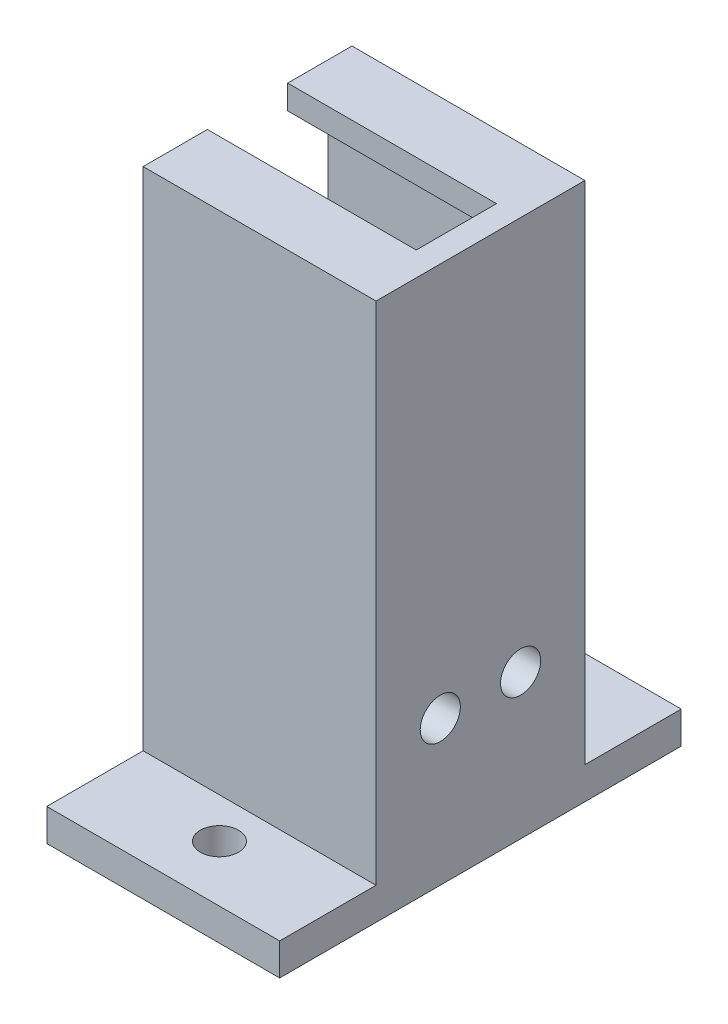
ISO-10303-21;
HEADER;
FILE_DESCRIPTION(('STEP AP214'),'2;1');
FILE_NAME('part.step','',(''),(''),'','','');
FILE_SCHEMA(('AUTOMOTIVE_DESIGN { 1 0 10303 214 1 1 1 1 }'));
ENDSEC;
DATA;
#1=APPLICATION_CONTEXT('core data for automotive mechanical design processes');
#2=APPLICATION_PROTOCOL_DEFINITION('international standard','automotive_design',2000,#1);
#3=PRODUCT_CONTEXT('',#1,'mechanical');
#4=PRODUCT('Part','Part','',(#3));
#5=PRODUCT_RELATED_PRODUCT_CATEGORY('part','',(#4));
#6=PRODUCT_DEFINITION_FORMATION('','',#4);
#7=PRODUCT_DEFINITION_CONTEXT('part definition',#1,'design');
#8=PRODUCT_DEFINITION('design','',#6,#7);
#9=PRODUCT_DEFINITION_SHAPE('','',#8);
#10=(LENGTH_UNIT() NAMED_UNIT(*) SI_UNIT(.MILLI.,.METRE.));
#11=(NAMED_UNIT(*) PLANE_ANGLE_UNIT() SI_UNIT($,.RADIAN.));
#12=(NAMED_UNIT(*) SI_UNIT($,.STERADIAN.) SOLID_ANGLE_UNIT());
#13=UNCERTAINTY_MEASURE_WITH_UNIT(LENGTH_MEASURE(1.E-05),#10,'distance_accuracy_value','');
#14=(GEOMETRIC_REPRESENTATION_CONTEXT(3) GLOBAL_UNCERTAINTY_ASSIGNED_CONTEXT((#13)) GLOBAL_UNIT_ASSIGNED_CONTEXT((#10,
#11,#12)) REPRESENTATION_CONTEXT('',''));
#15=CARTESIAN_POINT('',(0.,0.,0.));
#16=DIRECTION('',(0.,0.,1.));
#17=DIRECTION('',(1.,0.,0.));
#18=AXIS2_PLACEMENT_3D('',#15,#16,#17);
#19=CARTESIAN_POINT('',(0.,44.,26.));
#20=DIRECTION('',(0.,-1.,0.));
#21=DIRECTION('',(0.,0.,-1.));
#22=AXIS2_PLACEMENT_3D('',#19,#20,#21);
#23=PLANE('',#22);
#24=DIRECTION('',(-1.,0.,0.));
#25=VECTOR('',#24,1.);
#26=CARTESIAN_POINT('',(0.,44.,18.));
#27=LINE('',#26,#25);
#28=CARTESIAN_POINT('',(26.,44.,18.));
#29=VERTEX_POINT('',#28);
#30=CARTESIAN_POINT('',(0.,44.,18.));
#31=VERTEX_POINT('',#30);
#32=EDGE_CURVE('E11',#29,#31,#27,.T.);
#33=ORIENTED_EDGE('',*,*,#32,.F.);
#34=DIRECTION('',(0.,0.,-1.));
#35=VECTOR('',#34,1.);
#36=CARTESIAN_POINT('',(26.,44.,26.));
#37=LINE('',#36,#35);
#38=CARTESIAN_POINT('',(26.,44.,23.));
#39=VERTEX_POINT('',#38);
#40=EDGE_CURVE('E246',#39,#29,#37,.T.);
#41=ORIENTED_EDGE('',*,*,#40,.F.);
#42=DIRECTION('',(-1.,0.,0.));
#43=VECTOR('',#42,1.);
#44=CARTESIAN_POINT('',(0.,44.,23.));
#45=LINE('',#44,#43);
#46=CARTESIAN_POINT('',(0.,44.,23.));
#47=VERTEX_POINT('',#46);
#48=EDGE_CURVE('E261',#39,#47,#45,.T.);
#49=ORIENTED_EDGE('',*,*,#48,.T.);
#50=DIRECTION('',(0.,0.,-1.));
#51=VECTOR('',#50,1.);
#52=CARTESIAN_POINT('',(0.,44.,26.));
#53=LINE('',#52,#51);
#54=EDGE_CURVE('E274',#47,#31,#53,.T.);
#55=ORIENTED_EDGE('',*,*,#54,.T.);
#56=EDGE_LOOP('',(#33,#41,#49,#55));
#57=FACE_BOUND('',#56,.T.);
#58=ADVANCED_FACE('F39',(#57),#23,.T.);
#59=CARTESIAN_POINT('',(0.,0.,26.));
#60=DIRECTION('',(1.,0.,0.));
#61=DIRECTION('',(0.,1.,0.));
#62=AXIS2_PLACEMENT_3D('',#59,#60,#61);
#63=PLANE('',#62);
#64=CARTESIAN_POINT('',(0.,-2.,8.));
#65=DIRECTION('',(-1.,0.,0.));
#66=DIRECTION('',(0.,-1.,0.));
#67=AXIS2_PLACEMENT_3D('',#64,#65,#66);
#68=CIRCLE('',#67,2.5);
#69=CARTESIAN_POINT('',(0.,-4.5,8.));
#70=VERTEX_POINT('',#69);
#71=EDGE_CURVE('E198',#70,#70,#68,.T.);
#72=ORIENTED_EDGE('',*,*,#71,.F.);
#73=EDGE_LOOP('',(#72));
#74=FACE_BOUND('',#73,.T.);
#75=CARTESIAN_POINT('',(0.,-2.,18.));
#76=DIRECTION('',(-1.,0.,0.));
#77=DIRECTION('',(0.,-1.,0.));
#78=AXIS2_PLACEMENT_3D('',#75,#76,#77);
#79=CIRCLE('',#78,2.49999999999999);
#80=CARTESIAN_POINT('',(0.,-4.5,18.));
#81=VERTEX_POINT('',#80);
#82=EDGE_CURVE('E182',#81,#81,#79,.T.);
#83=ORIENTED_EDGE('',*,*,#82,.F.);
#84=EDGE_LOOP('',(#83));
#85=FACE_BOUND('',#84,.T.);
#86=DIRECTION('',(0.,0.,-1.));
#87=VECTOR('',#86,1.);
#88=CARTESIAN_POINT('',(0.,47.,26.));
#89=LINE('',#88,#87);
#90=CARTESIAN_POINT('',(0.,47.,26.));
#91=VERTEX_POINT('',#90);
#92=CARTESIAN_POINT('',(0.,47.,18.));
#93=VERTEX_POINT('',#92);
#94=EDGE_CURVE('E300',#91,#93,#89,.T.);
#95=ORIENTED_EDGE('',*,*,#94,.T.);
#96=DIRECTION('',(0.,1.,0.));
#97=VECTOR('',#96,1.);
#98=CARTESIAN_POINT('',(0.,39.8846153846153,18.));
#99=LINE('',#98,#97);
#100=EDGE_CURVE('E212',#31,#93,#99,.T.);
#101=ORIENTED_EDGE('',*,*,#100,.F.);
#102=ORIENTED_EDGE('',*,*,#54,.F.);
#103=DIRECTION('',(0.,-1.,0.));
#104=VECTOR('',#103,1.);
#105=CARTESIAN_POINT('',(0.,0.,23.));
#106=LINE('',#105,#104);
#107=CARTESIAN_POINT('',(0.,3.,23.));
#108=VERTEX_POINT('',#107);
#109=EDGE_CURVE('E63',#47,#108,#106,.T.);
#110=ORIENTED_EDGE('',*,*,#109,.T.);
#111=DIRECTION('',(0.,0.,-1.));
#112=VECTOR('',#111,1.);
#113=CARTESIAN_POINT('',(0.,3.,26.));
#114=LINE('',#113,#112);
#115=CARTESIAN_POINT('',(0.,3.,3.));
#116=VERTEX_POINT('',#115);
#117=EDGE_CURVE('E245',#108,#116,#114,.T.);
#118=ORIENTED_EDGE('',*,*,#117,.T.);
#119=DIRECTION('',(0.,-1.,0.));
#120=VECTOR('',#119,1.);
#121=CARTESIAN_POINT('',(0.,0.,3.));
#122=LINE('',#121,#120);
#123=CARTESIAN_POINT('',(0.,44.,3.));
#124=VERTEX_POINT('',#123);
#125=EDGE_CURVE('E236',#124,#116,#122,.T.);
#126=ORIENTED_EDGE('',*,*,#125,.F.);
#127=CARTESIAN_POINT('',(0.,44.,8.));
#128=VERTEX_POINT('',#127);
#129=EDGE_CURVE('E267',#128,#124,#53,.T.);
#130=ORIENTED_EDGE('',*,*,#129,.F.);
#131=DIRECTION('',(0.,-1.,0.));
#132=VECTOR('',#131,1.);
#133=CARTESIAN_POINT('',(0.,39.8846153846153,8.));
#134=LINE('',#133,#132);
#135=CARTESIAN_POINT('',(0.,47.,8.));
#136=VERTEX_POINT('',#135);
#137=EDGE_CURVE('E217',#136,#128,#134,.T.);
#138=ORIENTED_EDGE('',*,*,#137,.F.);
#139=CARTESIAN_POINT('',(0.,47.,0.));
#140=VERTEX_POINT('',#139);
#141=EDGE_CURVE('E291',#136,#140,#89,.T.);
#142=ORIENTED_EDGE('',*,*,#141,.T.);
#143=DIRECTION('',(0.,-1.,0.));
#144=VECTOR('',#143,1.);
#145=CARTESIAN_POINT('',(0.,0.,0.));
#146=LINE('',#145,#144);
#147=CARTESIAN_POINT('',(0.,-16.,0.));
#148=VERTEX_POINT('',#147);
#149=EDGE_CURVE('E271',#140,#148,#146,.T.);
#150=ORIENTED_EDGE('',*,*,#149,.T.);
#151=DIRECTION('',(0.,0.,-1.));
#152=VECTOR('',#151,1.);
#153=CARTESIAN_POINT('',(0.,-16.,-12.));
#154=LINE('',#153,#152);
#155=CARTESIAN_POINT('',(0.,-16.,-12.));
#156=VERTEX_POINT('',#155);
#157=EDGE_CURVE('E409',#148,#156,#154,.T.);
#158=ORIENTED_EDGE('',*,*,#157,.T.);
#159=DIRECTION('',(0.,1.,0.));
#160=VECTOR('',#159,1.);
#161=CARTESIAN_POINT('',(0.,-20.,-12.));
#162=LINE('',#161,#160);
#163=CARTESIAN_POINT('',(0.,-20.,-12.));
#164=VERTEX_POINT('',#163);
#165=EDGE_CURVE('E189',#164,#156,#162,.T.);
#166=ORIENTED_EDGE('',*,*,#165,.F.);
#167=DIRECTION('',(0.,0.,-1.));
#168=VECTOR('',#167,1.);
#169=CARTESIAN_POINT('',(0.,-20.,-12.));
#170=LINE('',#169,#168);
#171=CARTESIAN_POINT('',(0.,-20.,38.));
#172=VERTEX_POINT('',#171);
#173=EDGE_CURVE('E163',#172,#164,#170,.T.);
#174=ORIENTED_EDGE('',*,*,#173,.F.);
#175=DIRECTION('',(0.,1.,0.));
#176=VECTOR('',#175,1.);
#177=CARTESIAN_POINT('',(0.,-20.,38.));
#178=LINE('',#177,#176);
#179=CARTESIAN_POINT('',(0.,-16.,38.));
#180=VERTEX_POINT('',#179);
#181=EDGE_CURVE('E159',#172,#180,#178,.T.);
#182=ORIENTED_EDGE('',*,*,#181,.T.);
#183=CARTESIAN_POINT('',(0.,-16.,26.));
#184=VERTEX_POINT('',#183);
#185=EDGE_CURVE('E413',#180,#184,#154,.T.);
#186=ORIENTED_EDGE('',*,*,#185,.T.);
#187=DIRECTION('',(0.,-1.,0.));
#188=VECTOR('',#187,1.);
#189=CARTESIAN_POINT('',(0.,0.,26.));
#190=LINE('',#189,#188);
#191=EDGE_CURVE('E281',#91,#184,#190,.T.);
#192=ORIENTED_EDGE('',*,*,#191,.F.);
#193=EDGE_LOOP('',(#95,#101,#102,#110,#118,#126,#130,#138,#142,#150,#158,#166,#174,#182,#186,#192));
#194=FACE_BOUND('',#193,.T.);
#195=ADVANCED_FACE('F41',(#74,#85,#194),#63,.F.);
#196=CARTESIAN_POINT('',(29.,0.,26.));
#197=DIRECTION('',(-1.,0.,0.));
#198=DIRECTION('',(0.,-1.,0.));
#199=AXIS2_PLACEMENT_3D('',#196,#197,#198);
#200=PLANE('',#199);
#201=CARTESIAN_POINT('',(29.,-2.00000000000001,8.));
#202=DIRECTION('',(-1.,0.,0.));
#203=DIRECTION('',(0.,-1.,0.));
#204=AXIS2_PLACEMENT_3D('',#201,#202,#203);
#205=CIRCLE('',#204,2.5);
#206=CARTESIAN_POINT('',(29.,-4.50000000000001,8.));
#207=VERTEX_POINT('',#206);
#208=EDGE_CURVE('E193',#207,#207,#205,.T.);
#209=ORIENTED_EDGE('',*,*,#208,.T.);
#210=EDGE_LOOP('',(#209));
#211=FACE_BOUND('',#210,.T.);
#212=CARTESIAN_POINT('',(29.,-2.00000000000001,18.));
#213=DIRECTION('',(-1.,0.,0.));
#214=DIRECTION('',(0.,-1.,0.));
#215=AXIS2_PLACEMENT_3D('',#212,#213,#214);
#216=CIRCLE('',#215,2.49999999999999);
#217=CARTESIAN_POINT('',(29.,-4.5,18.));
#218=VERTEX_POINT('',#217);
#219=EDGE_CURVE('E187',#218,#218,#216,.T.);
#220=ORIENTED_EDGE('',*,*,#219,.T.);
#221=EDGE_LOOP('',(#220));
#222=FACE_BOUND('',#221,.T.);
#223=DIRECTION('',(0.,1.,0.));
#224=VECTOR('',#223,1.);
#225=CARTESIAN_POINT('',(29.,0.,0.));
#226=LINE('',#225,#224);
#227=CARTESIAN_POINT('',(29.,-16.,0.));
#228=VERTEX_POINT('',#227);
#229=CARTESIAN_POINT('',(29.,47.,0.));
#230=VERTEX_POINT('',#229);
#231=EDGE_CURVE('E294',#228,#230,#226,.T.);
#232=ORIENTED_EDGE('',*,*,#231,.T.);
#233=DIRECTION('',(0.,0.,-1.));
#234=VECTOR('',#233,1.);
#235=CARTESIAN_POINT('',(29.,47.,26.));
#236=LINE('',#235,#234);
#237=CARTESIAN_POINT('',(29.,47.,26.));
#238=VERTEX_POINT('',#237);
#239=EDGE_CURVE('E304',#238,#230,#236,.T.);
#240=ORIENTED_EDGE('',*,*,#239,.F.);
#241=DIRECTION('',(0.,1.,0.));
#242=VECTOR('',#241,1.);
#243=CARTESIAN_POINT('',(29.,0.,26.));
#244=LINE('',#243,#242);
#245=CARTESIAN_POINT('',(29.,-16.,26.));
#246=VERTEX_POINT('',#245);
#247=EDGE_CURVE('E284',#246,#238,#244,.T.);
#248=ORIENTED_EDGE('',*,*,#247,.F.);
#249=DIRECTION('',(0.,0.,1.));
#250=VECTOR('',#249,1.);
#251=CARTESIAN_POINT('',(29.,-16.,-12.));
#252=LINE('',#251,#250);
#253=CARTESIAN_POINT('',(29.,-16.,38.));
#254=VERTEX_POINT('',#253);
#255=EDGE_CURVE('E179',#246,#254,#252,.T.);
#256=ORIENTED_EDGE('',*,*,#255,.T.);
#257=DIRECTION('',(0.,1.,0.));
#258=VECTOR('',#257,1.);
#259=CARTESIAN_POINT('',(29.,-20.,38.));
#260=LINE('',#259,#258);
#261=CARTESIAN_POINT('',(29.,-20.,38.));
#262=VERTEX_POINT('',#261);
#263=EDGE_CURVE('E157',#262,#254,#260,.T.);
#264=ORIENTED_EDGE('',*,*,#263,.F.);
#265=DIRECTION('',(0.,0.,1.));
#266=VECTOR('',#265,1.);
#267=CARTESIAN_POINT('',(29.,-20.,-12.));
#268=LINE('',#267,#266);
#269=CARTESIAN_POINT('',(29.,-20.,-12.));
#270=VERTEX_POINT('',#269);
#271=EDGE_CURVE('E164',#270,#262,#268,.T.);
#272=ORIENTED_EDGE('',*,*,#271,.F.);
#273=DIRECTION('',(0.,1.,0.));
#274=VECTOR('',#273,1.);
#275=CARTESIAN_POINT('',(29.,-20.,-12.));
#276=LINE('',#275,#274);
#277=CARTESIAN_POINT('',(29.,-16.,-12.));
#278=VERTEX_POINT('',#277);
#279=EDGE_CURVE('E425',#270,#278,#276,.T.);
#280=ORIENTED_EDGE('',*,*,#279,.T.);
#281=EDGE_CURVE('E419',#278,#228,#252,.T.);
#282=ORIENTED_EDGE('',*,*,#281,.T.);
#283=EDGE_LOOP('',(#232,#240,#248,#256,#264,#272,#280,#282));
#284=FACE_BOUND('',#283,.T.);
#285=ADVANCED_FACE('F177',(#211,#222,#284),#200,.F.);
#286=CARTESIAN_POINT('',(0.,47.,26.));
#287=DIRECTION('',(0.,-1.,0.));
#288=DIRECTION('',(0.,0.,-1.));
#289=AXIS2_PLACEMENT_3D('',#286,#287,#288);
#290=PLANE('',#289);
#291=DIRECTION('',(0.,0.,1.));
#292=VECTOR('',#291,1.);
#293=CARTESIAN_POINT('',(26.,47.,26.));
#294=LINE('',#293,#292);
#295=CARTESIAN_POINT('',(26.,47.,8.));
#296=VERTEX_POINT('',#295);
#297=CARTESIAN_POINT('',(26.,47.,18.));
#298=VERTEX_POINT('',#297);
#299=EDGE_CURVE('E220',#296,#298,#294,.T.);
#300=ORIENTED_EDGE('',*,*,#299,.T.);
#301=DIRECTION('',(-1.,0.,0.));
#302=VECTOR('',#301,1.);
#303=CARTESIAN_POINT('',(0.,47.,18.));
#304=LINE('',#303,#302);
#305=EDGE_CURVE('E232',#298,#93,#304,.T.);
#306=ORIENTED_EDGE('',*,*,#305,.T.);
#307=ORIENTED_EDGE('',*,*,#94,.F.);
#308=DIRECTION('',(-1.,0.,0.));
#309=VECTOR('',#308,1.);
#310=CARTESIAN_POINT('',(0.,47.,26.));
#311=LINE('',#310,#309);
#312=EDGE_CURVE('E288',#238,#91,#311,.T.);
#313=ORIENTED_EDGE('',*,*,#312,.F.);
#314=ORIENTED_EDGE('',*,*,#239,.T.);
#315=DIRECTION('',(-1.,0.,0.));
#316=VECTOR('',#315,1.);
#317=CARTESIAN_POINT('',(0.,47.,0.));
#318=LINE('',#317,#316);
#319=EDGE_CURVE('E285',#230,#140,#318,.T.);
#320=ORIENTED_EDGE('',*,*,#319,.T.);
#321=ORIENTED_EDGE('',*,*,#141,.F.);
#322=DIRECTION('',(1.,0.,0.));
#323=VECTOR('',#322,1.);
#324=CARTESIAN_POINT('',(0.,47.,8.));
#325=LINE('',#324,#323);
#326=EDGE_CURVE('E228',#136,#296,#325,.T.);
#327=ORIENTED_EDGE('',*,*,#326,.T.);
#328=EDGE_LOOP('',(#300,#306,#307,#313,#314,#320,#321,#327));
#329=FACE_BOUND('',#328,.T.);
#330=ADVANCED_FACE('F358',(#329),#290,.F.);
#331=CARTESIAN_POINT('',(0.,0.,26.));
#332=DIRECTION('',(0.,0.,-1.));
#333=DIRECTION('',(-1.,0.,0.));
#334=AXIS2_PLACEMENT_3D('',#331,#332,#333);
#335=PLANE('',#334);
#336=ORIENTED_EDGE('',*,*,#191,.T.);
#337=DIRECTION('',(-1.,0.,0.));
#338=VECTOR('',#337,1.);
#339=CARTESIAN_POINT('',(0.,-16.,26.));
#340=LINE('',#339,#338);
#341=EDGE_CURVE('E208',#246,#184,#340,.T.);
#342=ORIENTED_EDGE('',*,*,#341,.F.);
#343=ORIENTED_EDGE('',*,*,#247,.T.);
#344=ORIENTED_EDGE('',*,*,#312,.T.);
#345=EDGE_LOOP('',(#336,#342,#343,#344));
#346=FACE_BOUND('',#345,.T.);
#347=ADVANCED_FACE('F355',(#346),#335,.F.);
#348=CARTESIAN_POINT('',(0.,0.,0.));
#349=DIRECTION('',(0.,0.,-1.));
#350=DIRECTION('',(-1.,0.,0.));
#351=AXIS2_PLACEMENT_3D('',#348,#349,#350);
#352=PLANE('',#351);
#353=ORIENTED_EDGE('',*,*,#149,.F.);
#354=ORIENTED_EDGE('',*,*,#319,.F.);
#355=ORIENTED_EDGE('',*,*,#231,.F.);
#356=DIRECTION('',(1.,0.,0.));
#357=VECTOR('',#356,1.);
#358=CARTESIAN_POINT('',(0.,-16.,0.));
#359=LINE('',#358,#357);
#360=EDGE_CURVE('E197',#148,#228,#359,.T.);
#361=ORIENTED_EDGE('',*,*,#360,.F.);
#362=EDGE_LOOP('',(#353,#354,#355,#361));
#363=FACE_BOUND('',#362,.T.);
#364=ADVANCED_FACE('F340',(#363),#352,.T.);
#365=CARTESIAN_POINT('',(0.,3.,26.));
#366=DIRECTION('',(0.,1.,0.));
#367=DIRECTION('',(0.,0.,1.));
#368=AXIS2_PLACEMENT_3D('',#365,#366,#367);
#369=PLANE('',#368);
#370=DIRECTION('',(1.,0.,0.));
#371=VECTOR('',#370,1.);
#372=CARTESIAN_POINT('',(0.,3.,3.));
#373=LINE('',#372,#371);
#374=CARTESIAN_POINT('',(26.,3.,3.));
#375=VERTEX_POINT('',#374);
#376=EDGE_CURVE('E237',#116,#375,#373,.T.);
#377=ORIENTED_EDGE('',*,*,#376,.F.);
#378=ORIENTED_EDGE('',*,*,#117,.F.);
#379=DIRECTION('',(1.,0.,0.));
#380=VECTOR('',#379,1.);
#381=CARTESIAN_POINT('',(0.,3.,23.));
#382=LINE('',#381,#380);
#383=CARTESIAN_POINT('',(26.,3.,23.));
#384=VERTEX_POINT('',#383);
#385=EDGE_CURVE('E247',#108,#384,#382,.T.);
#386=ORIENTED_EDGE('',*,*,#385,.T.);
#387=DIRECTION('',(0.,0.,-1.));
#388=VECTOR('',#387,1.);
#389=CARTESIAN_POINT('',(26.,3.,26.));
#390=LINE('',#389,#388);
#391=EDGE_CURVE('E241',#384,#375,#390,.T.);
#392=ORIENTED_EDGE('',*,*,#391,.T.);
#393=EDGE_LOOP('',(#377,#378,#386,#392));
#394=FACE_BOUND('',#393,.T.);
#395=ADVANCED_FACE('F327',(#394),#369,.T.);
#396=CARTESIAN_POINT('',(26.,0.,26.));
#397=DIRECTION('',(-1.,0.,0.));
#398=DIRECTION('',(0.,-1.,0.));
#399=AXIS2_PLACEMENT_3D('',#396,#397,#398);
#400=PLANE('',#399);
#401=ORIENTED_EDGE('',*,*,#40,.T.);
#402=DIRECTION('',(0.,1.,0.));
#403=VECTOR('',#402,1.);
#404=CARTESIAN_POINT('',(26.,39.8846153846153,18.));
#405=LINE('',#404,#403);
#406=EDGE_CURVE('E213',#29,#298,#405,.T.);
#407=ORIENTED_EDGE('',*,*,#406,.T.);
#408=ORIENTED_EDGE('',*,*,#299,.F.);
#409=DIRECTION('',(0.,-1.,0.));
#410=VECTOR('',#409,1.);
#411=CARTESIAN_POINT('',(26.,39.8846153846153,8.));
#412=LINE('',#411,#410);
#413=CARTESIAN_POINT('',(26.,44.,8.));
#414=VERTEX_POINT('',#413);
#415=EDGE_CURVE('E55',#296,#414,#412,.T.);
#416=ORIENTED_EDGE('',*,*,#415,.T.);
#417=CARTESIAN_POINT('',(26.,44.,3.));
#418=VERTEX_POINT('',#417);
#419=EDGE_CURVE('E258',#414,#418,#37,.T.);
#420=ORIENTED_EDGE('',*,*,#419,.T.);
#421=DIRECTION('',(0.,1.,0.));
#422=VECTOR('',#421,1.);
#423=CARTESIAN_POINT('',(26.,0.,3.));
#424=LINE('',#423,#422);
#425=EDGE_CURVE('E240',#375,#418,#424,.T.);
#426=ORIENTED_EDGE('',*,*,#425,.F.);
#427=ORIENTED_EDGE('',*,*,#391,.F.);
#428=DIRECTION('',(0.,1.,0.));
#429=VECTOR('',#428,1.);
#430=CARTESIAN_POINT('',(26.,0.,23.));
#431=LINE('',#430,#429);
#432=EDGE_CURVE('E250',#384,#39,#431,.T.);
#433=ORIENTED_EDGE('',*,*,#432,.T.);
#434=EDGE_LOOP('',(#401,#407,#408,#416,#420,#426,#427,#433));
#435=FACE_BOUND('',#434,.T.);
#436=ADVANCED_FACE('F330',(#435),#400,.T.);
#437=DIRECTION('',(1.,0.,0.));
#438=VECTOR('',#437,1.);
#439=CARTESIAN_POINT('',(0.,44.,8.));
#440=LINE('',#439,#438);
#441=EDGE_CURVE('E48',#128,#414,#440,.T.);
#442=ORIENTED_EDGE('',*,*,#441,.F.);
#443=ORIENTED_EDGE('',*,*,#129,.T.);
#444=DIRECTION('',(-1.,0.,0.));
#445=VECTOR('',#444,1.);
#446=CARTESIAN_POINT('',(0.,44.,3.));
#447=LINE('',#446,#445);
#448=EDGE_CURVE('E254',#418,#124,#447,.T.);
#449=ORIENTED_EDGE('',*,*,#448,.F.);
#450=ORIENTED_EDGE('',*,*,#419,.F.);
#451=EDGE_LOOP('',(#442,#443,#449,#450));
#452=FACE_BOUND('',#451,.T.);
#453=ADVANCED_FACE('F316',(#452),#23,.T.);
#454=CARTESIAN_POINT('',(0.,0.,23.));
#455=DIRECTION('',(0.,0.,-1.));
#456=DIRECTION('',(-1.,0.,0.));
#457=AXIS2_PLACEMENT_3D('',#454,#455,#456);
#458=PLANE('',#457);
#459=ORIENTED_EDGE('',*,*,#109,.F.);
#460=ORIENTED_EDGE('',*,*,#48,.F.);
#461=ORIENTED_EDGE('',*,*,#432,.F.);
#462=ORIENTED_EDGE('',*,*,#385,.F.);
#463=EDGE_LOOP('',(#459,#460,#461,#462));
#464=FACE_BOUND('',#463,.T.);
#465=ADVANCED_FACE('F338',(#464),#458,.T.);
#466=CARTESIAN_POINT('',(0.,0.,3.));
#467=DIRECTION('',(0.,0.,-1.));
#468=DIRECTION('',(-1.,0.,0.));
#469=AXIS2_PLACEMENT_3D('',#466,#467,#468);
#470=PLANE('',#469);
#471=ORIENTED_EDGE('',*,*,#125,.T.);
#472=ORIENTED_EDGE('',*,*,#376,.T.);
#473=ORIENTED_EDGE('',*,*,#425,.T.);
#474=ORIENTED_EDGE('',*,*,#448,.T.);
#475=EDGE_LOOP('',(#471,#472,#473,#474));
#476=FACE_BOUND('',#475,.T.);
#477=ADVANCED_FACE('F323',(#476),#470,.F.);
#478=CARTESIAN_POINT('',(26.,39.8846153846153,18.));
#479=DIRECTION('',(0.,0.,1.));
#480=DIRECTION('',(1.,0.,0.));
#481=AXIS2_PLACEMENT_3D('',#478,#479,#480);
#482=PLANE('',#481);
#483=ORIENTED_EDGE('',*,*,#406,.F.);
#484=ORIENTED_EDGE('',*,*,#32,.T.);
#485=ORIENTED_EDGE('',*,*,#100,.T.);
#486=ORIENTED_EDGE('',*,*,#305,.F.);
#487=EDGE_LOOP('',(#483,#484,#485,#486));
#488=FACE_BOUND('',#487,.T.);
#489=ADVANCED_FACE('F354',(#488),#482,.F.);
#490=CARTESIAN_POINT('',(26.,39.8846153846153,8.));
#491=DIRECTION('',(0.,0.,-1.));
#492=DIRECTION('',(-1.,0.,0.));
#493=AXIS2_PLACEMENT_3D('',#490,#491,#492);
#494=PLANE('',#493);
#495=ORIENTED_EDGE('',*,*,#137,.T.);
#496=ORIENTED_EDGE('',*,*,#441,.T.);
#497=ORIENTED_EDGE('',*,*,#415,.F.);
#498=ORIENTED_EDGE('',*,*,#326,.F.);
#499=EDGE_LOOP('',(#495,#496,#497,#498));
#500=FACE_BOUND('',#499,.T.);
#501=ADVANCED_FACE('F311',(#500),#494,.F.);
#502=CARTESIAN_POINT('',(29.,-2.00000000000001,18.));
#503=DIRECTION('',(-1.,0.,0.));
#504=DIRECTION('',(0.,-1.,0.));
#505=AXIS2_PLACEMENT_3D('',#502,#503,#504);
#506=CYLINDRICAL_SURFACE('',#505,2.49999999999999);
#507=CARTESIAN_POINT('',(29.,-4.5,18.));
#508=CARTESIAN_POINT('',(28.6979166666667,-4.5,18.));
#509=CARTESIAN_POINT('',(28.3958333333333,-4.5,18.));
#510=CARTESIAN_POINT('',(27.7916666666667,-4.5,18.));
#511=CARTESIAN_POINT('',(27.4895833333333,-4.5,18.));
#512=CARTESIAN_POINT('',(26.8854166666667,-4.5,18.));
#513=CARTESIAN_POINT('',(26.5833333333333,-4.5,18.));
#514=CARTESIAN_POINT('',(25.9791666666667,-4.5,18.));
#515=CARTESIAN_POINT('',(25.6770833333333,-4.5,18.));
#516=CARTESIAN_POINT('',(25.0729166666667,-4.5,18.));
#517=CARTESIAN_POINT('',(24.7708333333333,-4.5,18.));
#518=CARTESIAN_POINT('',(24.1666666666667,-4.5,18.));
#519=CARTESIAN_POINT('',(23.8645833333333,-4.5,18.));
#520=CARTESIAN_POINT('',(23.2604166666667,-4.5,18.));
#521=CARTESIAN_POINT('',(22.9583333333333,-4.5,18.));
#522=CARTESIAN_POINT('',(22.3541666666667,-4.5,18.));
#523=CARTESIAN_POINT('',(22.0520833333333,-4.5,18.));
#524=CARTESIAN_POINT('',(21.4479166666667,-4.5,18.));
#525=CARTESIAN_POINT('',(21.1458333333333,-4.5,18.));
#526=CARTESIAN_POINT('',(20.5416666666667,-4.5,18.));
#527=CARTESIAN_POINT('',(20.2395833333333,-4.5,18.));
#528=CARTESIAN_POINT('',(19.6354166666667,-4.5,18.));
#529=CARTESIAN_POINT('',(19.3333333333333,-4.5,18.));
#530=CARTESIAN_POINT('',(18.7291666666667,-4.5,18.));
#531=CARTESIAN_POINT('',(18.4270833333333,-4.5,18.));
#532=CARTESIAN_POINT('',(17.8229166666667,-4.5,18.));
#533=CARTESIAN_POINT('',(17.5208333333333,-4.5,18.));
#534=CARTESIAN_POINT('',(16.9166666666667,-4.5,18.));
#535=CARTESIAN_POINT('',(16.6145833333333,-4.5,18.));
#536=CARTESIAN_POINT('',(16.0104166666667,-4.5,18.));
#537=CARTESIAN_POINT('',(15.7083333333333,-4.5,18.));
#538=CARTESIAN_POINT('',(15.1041666666667,-4.5,18.));
#539=CARTESIAN_POINT('',(14.8020833333333,-4.5,18.));
#540=CARTESIAN_POINT('',(14.1979166666667,-4.5,18.));
#541=CARTESIAN_POINT('',(13.8958333333333,-4.5,18.));
#542=CARTESIAN_POINT('',(13.2916666666667,-4.5,18.));
#543=CARTESIAN_POINT('',(12.9895833333333,-4.5,18.));
#544=CARTESIAN_POINT('',(12.3854166666667,-4.5,18.));
#545=CARTESIAN_POINT('',(12.0833333333333,-4.5,18.));
#546=CARTESIAN_POINT('',(11.4791666666667,-4.5,18.));
#547=CARTESIAN_POINT('',(11.1770833333333,-4.5,18.));
#548=CARTESIAN_POINT('',(10.5729166666667,-4.5,18.));
#549=CARTESIAN_POINT('',(10.2708333333333,-4.5,18.));
#550=CARTESIAN_POINT('',(9.66666666666667,-4.5,18.));
#551=CARTESIAN_POINT('',(9.36458333333333,-4.5,18.));
#552=CARTESIAN_POINT('',(8.76041666666667,-4.5,18.));
#553=CARTESIAN_POINT('',(8.45833333333333,-4.5,18.));
#554=CARTESIAN_POINT('',(7.85416666666667,-4.5,18.));
#555=CARTESIAN_POINT('',(7.55208333333333,-4.5,18.));
#556=CARTESIAN_POINT('',(6.94791666666667,-4.5,18.));
#557=CARTESIAN_POINT('',(6.64583333333333,-4.5,18.));
#558=CARTESIAN_POINT('',(6.04166666666667,-4.5,18.));
#559=CARTESIAN_POINT('',(5.73958333333333,-4.5,18.));
#560=CARTESIAN_POINT('',(5.13541666666667,-4.5,18.));
#561=CARTESIAN_POINT('',(4.83333333333333,-4.5,18.));
#562=CARTESIAN_POINT('',(4.22916666666667,-4.5,18.));
#563=CARTESIAN_POINT('',(3.92708333333333,-4.5,18.));
#564=CARTESIAN_POINT('',(3.32291666666667,-4.5,18.));
#565=CARTESIAN_POINT('',(3.02083333333333,-4.5,18.));
#566=CARTESIAN_POINT('',(2.41666666666667,-4.5,18.));
#567=CARTESIAN_POINT('',(2.11458333333333,-4.5,18.));
#568=CARTESIAN_POINT('',(1.51041666666667,-4.5,18.));
#569=CARTESIAN_POINT('',(1.20833333333333,-4.5,18.));
#570=CARTESIAN_POINT('',(0.604166666666667,-4.5,18.));
#571=CARTESIAN_POINT('',(0.302083333333333,-4.5,18.));
#572=CARTESIAN_POINT('',(0.,-4.5,18.));
#573=B_SPLINE_CURVE_WITH_KNOTS('',3,(#507,#508,#509,#510,#511,#512,#513,#514,#515,#516,#517,
#518,#519,#520,#521,#522,#523,#524,#525,#526,#527,#528,#529,#530,#531,#532,#533,#534,#535,#536,
#537,#538,#539,#540,#541,#542,#543,#544,#545,#546,#547,#548,#549,#550,#551,#552,#553,#554,#555,
#556,#557,#558,#559,#560,#561,#562,#563,#564,#565,#566,#567,#568,#569,#570,#571,#572),
.UNSPECIFIED.,.F.,.F.,(4,2,2,2,2,2,2,2,2,2,2,2,2,2,2,2,2,2,2,2,2,2,2,2,2,2,2,2,2,2,2,2,4),(0.,
0.906249999999997,1.8125,2.71875,3.625,4.53125,5.4375,6.34375,7.25,8.15625,9.0625,9.96875,
10.875,11.78125,12.6875,13.59375,14.5,15.40625,16.3125,17.21875,18.125,19.03125,19.9375,
20.84375,21.75,22.65625,23.5625,24.46875,25.375,26.28125,27.1875,28.09375,29.),.UNSPECIFIED.);
#574=EDGE_CURVE('BSEAM373',#218,#81,#573,.T.);
#575=ORIENTED_EDGE('',*,*,#219,.F.);
#576=ORIENTED_EDGE('',*,*,#82,.T.);
#577=ORIENTED_EDGE('',*,*,#574,.T.);
#578=ORIENTED_EDGE('',*,*,#574,.F.);
#579=EDGE_LOOP('',(#575,#577,#576,#578));
#580=FACE_BOUND('',#579,.T.);
#581=ADVANCED_FACE('F373',(#580),#506,.F.);
#582=CARTESIAN_POINT('',(29.,-2.00000000000001,8.));
#583=DIRECTION('',(-1.,0.,0.));
#584=DIRECTION('',(0.,-1.,0.));
#585=AXIS2_PLACEMENT_3D('',#582,#583,#584);
#586=CYLINDRICAL_SURFACE('',#585,2.5);
#587=CARTESIAN_POINT('',(29.,-4.50000000000001,8.));
#588=CARTESIAN_POINT('',(28.6979166666667,-4.50000000000001,8.));
#589=CARTESIAN_POINT('',(28.3958333333333,-4.50000000000001,8.));
#590=CARTESIAN_POINT('',(27.7916666666667,-4.50000000000001,8.));
#591=CARTESIAN_POINT('',(27.4895833333333,-4.50000000000001,8.));
#592=CARTESIAN_POINT('',(26.8854166666667,-4.50000000000001,8.));
#593=CARTESIAN_POINT('',(26.5833333333333,-4.50000000000001,8.));
#594=CARTESIAN_POINT('',(25.9791666666667,-4.50000000000001,8.));
#595=CARTESIAN_POINT('',(25.6770833333333,-4.50000000000001,8.));
#596=CARTESIAN_POINT('',(25.0729166666667,-4.50000000000001,8.));
#597=CARTESIAN_POINT('',(24.7708333333333,-4.50000000000001,8.));
#598=CARTESIAN_POINT('',(24.1666666666667,-4.50000000000001,8.));
#599=CARTESIAN_POINT('',(23.8645833333333,-4.50000000000001,8.));
#600=CARTESIAN_POINT('',(23.2604166666667,-4.50000000000001,8.));
#601=CARTESIAN_POINT('',(22.9583333333333,-4.50000000000001,8.));
#602=CARTESIAN_POINT('',(22.3541666666667,-4.50000000000001,8.));
#603=CARTESIAN_POINT('',(22.0520833333333,-4.50000000000001,8.));
#604=CARTESIAN_POINT('',(21.4479166666667,-4.50000000000001,8.));
#605=CARTESIAN_POINT('',(21.1458333333333,-4.50000000000001,8.));
#606=CARTESIAN_POINT('',(20.5416666666667,-4.50000000000001,8.));
#607=CARTESIAN_POINT('',(20.2395833333333,-4.50000000000001,8.));
#608=CARTESIAN_POINT('',(19.6354166666667,-4.50000000000001,8.));
#609=CARTESIAN_POINT('',(19.3333333333333,-4.5,8.));
#610=CARTESIAN_POINT('',(18.7291666666667,-4.5,8.));
#611=CARTESIAN_POINT('',(18.4270833333333,-4.5,8.));
#612=CARTESIAN_POINT('',(17.8229166666667,-4.5,8.));
#613=CARTESIAN_POINT('',(17.5208333333333,-4.5,8.));
#614=CARTESIAN_POINT('',(16.9166666666667,-4.5,8.));
#615=CARTESIAN_POINT('',(16.6145833333333,-4.5,8.));
#616=CARTESIAN_POINT('',(16.0104166666667,-4.5,8.));
#617=CARTESIAN_POINT('',(15.7083333333333,-4.5,8.));
#618=CARTESIAN_POINT('',(15.1041666666667,-4.5,8.));
#619=CARTESIAN_POINT('',(14.8020833333333,-4.5,8.));
#620=CARTESIAN_POINT('',(14.1979166666667,-4.5,8.));
#621=CARTESIAN_POINT('',(13.8958333333333,-4.5,8.));
#622=CARTESIAN_POINT('',(13.2916666666667,-4.5,8.));
#623=CARTESIAN_POINT('',(12.9895833333333,-4.5,8.));
#624=CARTESIAN_POINT('',(12.3854166666667,-4.5,8.));
#625=CARTESIAN_POINT('',(12.0833333333333,-4.5,8.));
#626=CARTESIAN_POINT('',(11.4791666666667,-4.5,8.));
#627=CARTESIAN_POINT('',(11.1770833333333,-4.5,8.));
#628=CARTESIAN_POINT('',(10.5729166666667,-4.5,8.));
#629=CARTESIAN_POINT('',(10.2708333333333,-4.5,8.));
#630=CARTESIAN_POINT('',(9.66666666666667,-4.5,8.));
#631=CARTESIAN_POINT('',(9.36458333333333,-4.5,8.));
#632=CARTESIAN_POINT('',(8.76041666666667,-4.5,8.));
#633=CARTESIAN_POINT('',(8.45833333333333,-4.5,8.));
#634=CARTESIAN_POINT('',(7.85416666666667,-4.5,8.));
#635=CARTESIAN_POINT('',(7.55208333333333,-4.5,8.));
#636=CARTESIAN_POINT('',(6.94791666666667,-4.5,8.));
#637=CARTESIAN_POINT('',(6.64583333333333,-4.5,8.));
#638=CARTESIAN_POINT('',(6.04166666666667,-4.5,8.));
#639=CARTESIAN_POINT('',(5.73958333333333,-4.5,8.));
#640=CARTESIAN_POINT('',(5.13541666666667,-4.5,8.));
#641=CARTESIAN_POINT('',(4.83333333333333,-4.5,8.));
#642=CARTESIAN_POINT('',(4.22916666666667,-4.5,8.));
#643=CARTESIAN_POINT('',(3.92708333333333,-4.5,8.));
#644=CARTESIAN_POINT('',(3.32291666666667,-4.5,8.));
#645=CARTESIAN_POINT('',(3.02083333333333,-4.5,8.));
#646=CARTESIAN_POINT('',(2.41666666666667,-4.5,8.));
#647=CARTESIAN_POINT('',(2.11458333333333,-4.5,8.));
#648=CARTESIAN_POINT('',(1.51041666666667,-4.5,8.));
#649=CARTESIAN_POINT('',(1.20833333333333,-4.5,8.));
#650=CARTESIAN_POINT('',(0.604166666666667,-4.5,8.));
#651=CARTESIAN_POINT('',(0.302083333333333,-4.5,8.));
#652=CARTESIAN_POINT('',(0.,-4.5,8.));
#653=B_SPLINE_CURVE_WITH_KNOTS('',3,(#587,#588,#589,#590,#591,#592,#593,#594,#595,#596,#597,
#598,#599,#600,#601,#602,#603,#604,#605,#606,#607,#608,#609,#610,#611,#612,#613,#614,#615,#616,
#617,#618,#619,#620,#621,#622,#623,#624,#625,#626,#627,#628,#629,#630,#631,#632,#633,#634,#635,
#636,#637,#638,#639,#640,#641,#642,#643,#644,#645,#646,#647,#648,#649,#650,#651,#652),
.UNSPECIFIED.,.F.,.F.,(4,2,2,2,2,2,2,2,2,2,2,2,2,2,2,2,2,2,2,2,2,2,2,2,2,2,2,2,2,2,2,2,4),(0.,
0.906249999999997,1.8125,2.71875,3.625,4.53125,5.4375,6.34375,7.25,8.15625,9.0625,9.96875,
10.875,11.78125,12.6875,13.59375,14.5,15.40625,16.3125,17.21875,18.125,19.03125,19.9375,
20.84375,21.75,22.65625,23.5625,24.46875,25.375,26.28125,27.1875,28.09375,29.),.UNSPECIFIED.);
#654=EDGE_CURVE('BSEAM376',#207,#70,#653,.T.);
#655=ORIENTED_EDGE('',*,*,#208,.F.);
#656=ORIENTED_EDGE('',*,*,#71,.T.);
#657=ORIENTED_EDGE('',*,*,#654,.T.);
#658=ORIENTED_EDGE('',*,*,#654,.F.);
#659=EDGE_LOOP('',(#655,#657,#656,#658));
#660=FACE_BOUND('',#659,.T.);
#661=ADVANCED_FACE('F376',(#660),#586,.F.);
#662=CARTESIAN_POINT('',(0.,-16.,0.));
#663=DIRECTION('',(0.,1.,0.));
#664=DIRECTION('',(0.,0.,1.));
#665=AXIS2_PLACEMENT_3D('',#662,#663,#664);
#666=PLANE('',#665);
#667=CARTESIAN_POINT('',(14.5,-16.,-5.));
#668=DIRECTION('',(0.,-1.,0.));
#669=DIRECTION('',(0.,0.,-1.));
#670=AXIS2_PLACEMENT_3D('',#667,#668,#669);
#671=CIRCLE('',#670,2.38125);
#672=CARTESIAN_POINT('',(14.5,-16.,-7.38125000000001));
#673=VERTEX_POINT('',#672);
#674=EDGE_CURVE('E449',#673,#673,#671,.T.);
#675=ORIENTED_EDGE('',*,*,#674,.T.);
#676=EDGE_LOOP('',(#675));
#677=FACE_BOUND('',#676,.T.);
#678=ORIENTED_EDGE('',*,*,#157,.F.);
#679=ORIENTED_EDGE('',*,*,#360,.T.);
#680=ORIENTED_EDGE('',*,*,#281,.F.);
#681=DIRECTION('',(1.,0.,0.));
#682=VECTOR('',#681,1.);
#683=CARTESIAN_POINT('',(0.,-16.,-12.));
#684=LINE('',#683,#682);
#685=EDGE_CURVE('E175',#156,#278,#684,.T.);
#686=ORIENTED_EDGE('',*,*,#685,.F.);
#687=EDGE_LOOP('',(#678,#679,#680,#686));
#688=FACE_BOUND('',#687,.T.);
#689=ADVANCED_FACE('F384',(#677,#688),#666,.T.);
#690=CARTESIAN_POINT('',(0.,-20.,0.));
#691=DIRECTION('',(0.,1.,0.));
#692=DIRECTION('',(0.,0.,1.));
#693=AXIS2_PLACEMENT_3D('',#690,#691,#692);
#694=PLANE('',#693);
#695=ORIENTED_EDGE('',*,*,#271,.T.);
#696=DIRECTION('',(-1.,0.,0.));
#697=VECTOR('',#696,1.);
#698=CARTESIAN_POINT('',(0.,-20.,38.));
#699=LINE('',#698,#697);
#700=EDGE_CURVE('E153',#262,#172,#699,.T.);
#701=ORIENTED_EDGE('',*,*,#700,.T.);
#702=ORIENTED_EDGE('',*,*,#173,.T.);
#703=DIRECTION('',(1.,0.,0.));
#704=VECTOR('',#703,1.);
#705=CARTESIAN_POINT('',(0.,-20.,-12.));
#706=LINE('',#705,#704);
#707=EDGE_CURVE('E170',#164,#270,#706,.T.);
#708=ORIENTED_EDGE('',*,*,#707,.T.);
#709=EDGE_LOOP('',(#695,#701,#702,#708));
#710=FACE_BOUND('',#709,.T.);
#711=CARTESIAN_POINT('',(14.5,-20.,31.));
#712=DIRECTION('',(0.,-1.,0.));
#713=DIRECTION('',(0.,0.,-1.));
#714=AXIS2_PLACEMENT_3D('',#711,#712,#713);
#715=CIRCLE('',#714,2.38125);
#716=CARTESIAN_POINT('',(14.5,-20.,28.61875));
#717=VERTEX_POINT('',#716);
#718=EDGE_CURVE('E437',#717,#717,#715,.T.);
#719=ORIENTED_EDGE('',*,*,#718,.F.);
#720=EDGE_LOOP('',(#719));
#721=FACE_BOUND('',#720,.T.);
#722=CARTESIAN_POINT('',(14.5,-20.,-5.));
#723=DIRECTION('',(0.,-1.,0.));
#724=DIRECTION('',(0.,0.,-1.));
#725=AXIS2_PLACEMENT_3D('',#722,#723,#724);
#726=CIRCLE('',#725,2.38125);
#727=CARTESIAN_POINT('',(14.5,-20.,-7.38125000000001));
#728=VERTEX_POINT('',#727);
#729=EDGE_CURVE('E446',#728,#728,#726,.T.);
#730=ORIENTED_EDGE('',*,*,#729,.F.);
#731=EDGE_LOOP('',(#730));
#732=FACE_BOUND('',#731,.T.);
#733=ADVANCED_FACE('F167',(#710,#721,#732),#694,.F.);
#734=CARTESIAN_POINT('',(14.5,-16.,31.));
#735=DIRECTION('',(0.,-1.,0.));
#736=DIRECTION('',(0.,0.,-1.));
#737=AXIS2_PLACEMENT_3D('',#734,#735,#736);
#738=CIRCLE('',#737,2.38125);
#739=CARTESIAN_POINT('',(14.5,-16.,28.61875));
#740=VERTEX_POINT('',#739);
#741=EDGE_CURVE('E440',#740,#740,#738,.T.);
#742=ORIENTED_EDGE('',*,*,#741,.T.);
#743=EDGE_LOOP('',(#742));
#744=FACE_BOUND('',#743,.T.);
#745=ORIENTED_EDGE('',*,*,#255,.F.);
#746=ORIENTED_EDGE('',*,*,#341,.T.);
#747=ORIENTED_EDGE('',*,*,#185,.F.);
#748=DIRECTION('',(-1.,0.,0.));
#749=VECTOR('',#748,1.);
#750=CARTESIAN_POINT('',(0.,-16.,38.));
#751=LINE('',#750,#749);
#752=EDGE_CURVE('E414',#254,#180,#751,.T.);
#753=ORIENTED_EDGE('',*,*,#752,.F.);
#754=EDGE_LOOP('',(#745,#746,#747,#753));
#755=FACE_BOUND('',#754,.T.);
#756=ADVANCED_FACE('F461',(#744,#755),#666,.T.);
#757=CARTESIAN_POINT('',(0.,-20.,38.));
#758=DIRECTION('',(0.,0.,-1.));
#759=DIRECTION('',(-1.,0.,0.));
#760=AXIS2_PLACEMENT_3D('',#757,#758,#759);
#761=PLANE('',#760);
#762=ORIENTED_EDGE('',*,*,#752,.T.);
#763=ORIENTED_EDGE('',*,*,#181,.F.);
#764=ORIENTED_EDGE('',*,*,#700,.F.);
#765=ORIENTED_EDGE('',*,*,#263,.T.);
#766=EDGE_LOOP('',(#762,#763,#764,#765));
#767=FACE_BOUND('',#766,.T.);
#768=ADVANCED_FACE('F155',(#767),#761,.F.);
#769=CARTESIAN_POINT('',(0.,-20.,-12.));
#770=DIRECTION('',(0.,0.,1.));
#771=DIRECTION('',(1.,0.,0.));
#772=AXIS2_PLACEMENT_3D('',#769,#770,#771);
#773=PLANE('',#772);
#774=ORIENTED_EDGE('',*,*,#685,.T.);
#775=ORIENTED_EDGE('',*,*,#279,.F.);
#776=ORIENTED_EDGE('',*,*,#707,.F.);
#777=ORIENTED_EDGE('',*,*,#165,.T.);
#778=EDGE_LOOP('',(#774,#775,#776,#777));
#779=FACE_BOUND('',#778,.T.);
#780=ADVANCED_FACE('F429',(#779),#773,.F.);
#781=CARTESIAN_POINT('',(14.5,-20.,31.));
#782=DIRECTION('',(0.,1.,0.));
#783=DIRECTION('',(0.,0.,1.));
#784=AXIS2_PLACEMENT_3D('',#781,#782,#783);
#785=CYLINDRICAL_SURFACE('',#784,2.38125);
#786=ORIENTED_EDGE('',*,*,#718,.T.);
#787=EDGE_LOOP('',(#786));
#788=FACE_BOUND('',#787,.T.);
#789=ORIENTED_EDGE('',*,*,#741,.F.);
#790=EDGE_LOOP('',(#789));
#791=FACE_BOUND('',#790,.T.);
#792=ADVANCED_FACE('F471',(#788,#791),#785,.F.);
#793=CARTESIAN_POINT('',(14.5,-20.,-5.));
#794=DIRECTION('',(0.,1.,0.));
#795=DIRECTION('',(0.,0.,1.));
#796=AXIS2_PLACEMENT_3D('',#793,#794,#795);
#797=CYLINDRICAL_SURFACE('',#796,2.38125);
#798=ORIENTED_EDGE('',*,*,#729,.T.);
#799=EDGE_LOOP('',(#798));
#800=FACE_BOUND('',#799,.T.);
#801=ORIENTED_EDGE('',*,*,#674,.F.);
#802=EDGE_LOOP('',(#801));
#803=FACE_BOUND('',#802,.T.);
#804=ADVANCED_FACE('F457',(#800,#803),#797,.F.);
#805=CLOSED_SHELL('',(#58,#195,#285,#330,#347,#364,#395,#436,#453,#465,#477,#489,#501,#581,#661,
#689,#733,#756,#768,#780,#792,#804));
#806=MANIFOLD_SOLID_BREP('B2',#805);
#807=ADVANCED_BREP_SHAPE_REPRESENTATION('',(#18,#806),#14);
#808=SHAPE_DEFINITION_REPRESENTATION(#9,#807);
ENDSEC;
END-ISO-10303-21;
